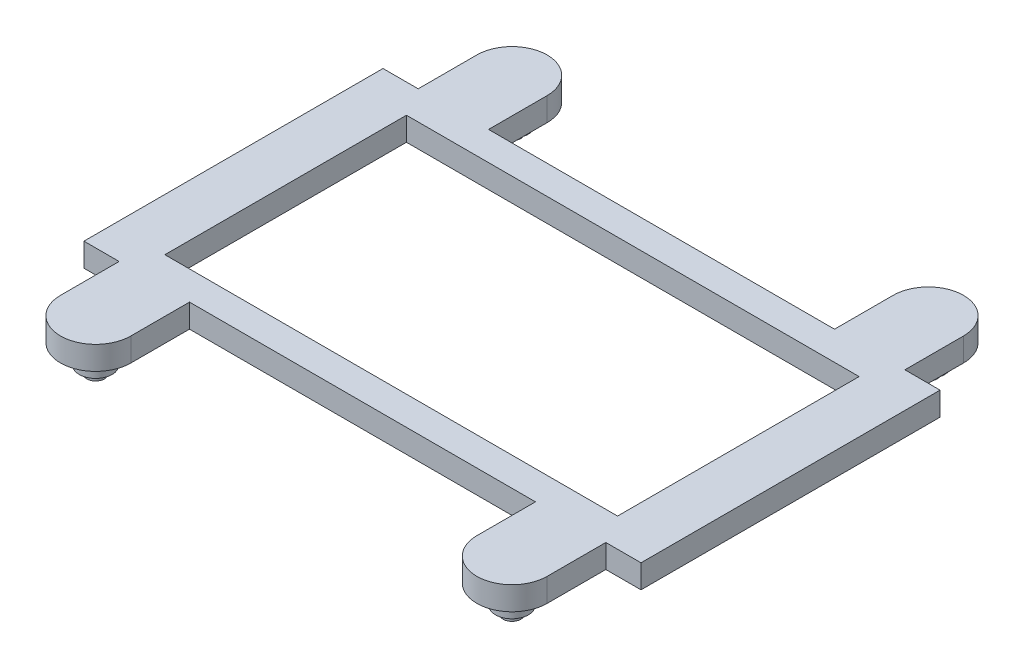
ISO-10303-21;
HEADER;
FILE_DESCRIPTION(('STEP AP214'),'2;1');
FILE_NAME('part.step','',(''),(''),'','','');
FILE_SCHEMA(('AUTOMOTIVE_DESIGN { 1 0 10303 214 1 1 1 1 }'));
ENDSEC;
DATA;
#1=APPLICATION_CONTEXT('core data for automotive mechanical design processes');
#2=APPLICATION_PROTOCOL_DEFINITION('international standard','automotive_design',2000,#1);
#3=PRODUCT_CONTEXT('',#1,'mechanical');
#4=PRODUCT('Part','Part','',(#3));
#5=PRODUCT_RELATED_PRODUCT_CATEGORY('part','',(#4));
#6=PRODUCT_DEFINITION_FORMATION('','',#4);
#7=PRODUCT_DEFINITION_CONTEXT('part definition',#1,'design');
#8=PRODUCT_DEFINITION('design','',#6,#7);
#9=PRODUCT_DEFINITION_SHAPE('','',#8);
#10=(LENGTH_UNIT() NAMED_UNIT(*) SI_UNIT(.MILLI.,.METRE.));
#11=(NAMED_UNIT(*) PLANE_ANGLE_UNIT() SI_UNIT($,.RADIAN.));
#12=(NAMED_UNIT(*) SI_UNIT($,.STERADIAN.) SOLID_ANGLE_UNIT());
#13=UNCERTAINTY_MEASURE_WITH_UNIT(LENGTH_MEASURE(1.E-05),#10,'distance_accuracy_value','');
#14=(GEOMETRIC_REPRESENTATION_CONTEXT(3) GLOBAL_UNCERTAINTY_ASSIGNED_CONTEXT((#13)) GLOBAL_UNIT_ASSIGNED_CONTEXT((#10,
#11,#12)) REPRESENTATION_CONTEXT('',''));
#15=CARTESIAN_POINT('',(0.,0.,0.));
#16=DIRECTION('',(0.,0.,1.));
#17=DIRECTION('',(1.,0.,0.));
#18=AXIS2_PLACEMENT_3D('',#15,#16,#17);
#19=CARTESIAN_POINT('',(-35.5,-8.6,-35.5));
#20=DIRECTION('',(0.,1.,0.));
#21=DIRECTION('',(0.,0.,1.));
#22=AXIS2_PLACEMENT_3D('',#19,#20,#21);
#23=CYLINDRICAL_SURFACE('',#22,1.5);
#24=CARTESIAN_POINT('',(-35.5,-8.6,-35.5));
#25=DIRECTION('',(0.,-1.,0.));
#26=DIRECTION('',(0.,0.,1.));
#27=AXIS2_PLACEMENT_3D('',#24,#25,#26);
#28=CIRCLE('',#27,1.5);
#29=CARTESIAN_POINT('',(-35.5,-8.6,-34.));
#30=VERTEX_POINT('',#29);
#31=EDGE_CURVE('E11',#30,#30,#28,.T.);
#32=ORIENTED_EDGE('',*,*,#31,.F.);
#33=EDGE_LOOP('',(#32));
#34=FACE_BOUND('',#33,.T.);
#35=CARTESIAN_POINT('',(-35.5,-7.3,-35.5));
#36=DIRECTION('',(0.,-1.,0.));
#37=DIRECTION('',(0.,0.,1.));
#38=AXIS2_PLACEMENT_3D('',#35,#36,#37);
#39=CIRCLE('',#38,1.5);
#40=CARTESIAN_POINT('',(-35.5,-7.3,-34.));
#41=VERTEX_POINT('',#40);
#42=EDGE_CURVE('E43',#41,#41,#39,.T.);
#43=ORIENTED_EDGE('',*,*,#42,.T.);
#44=EDGE_LOOP('',(#43));
#45=FACE_BOUND('',#44,.T.);
#46=ADVANCED_FACE('F40',(#34,#45),#23,.T.);
#47=CARTESIAN_POINT('',(-35.5,-8.6,-35.5));
#48=DIRECTION('',(0.,1.,0.));
#49=DIRECTION('',(0.,0.,1.));
#50=AXIS2_PLACEMENT_3D('',#47,#48,#49);
#51=PLANE('',#50);
#52=ORIENTED_EDGE('',*,*,#31,.T.);
#53=EDGE_LOOP('',(#52));
#54=FACE_BOUND('',#53,.T.);
#55=ADVANCED_FACE('F55',(#54),#51,.F.);
#56=CARTESIAN_POINT('',(-35.5,-7.3,-35.5));
#57=DIRECTION('',(0.,1.,0.));
#58=DIRECTION('',(0.,0.,1.));
#59=AXIS2_PLACEMENT_3D('',#56,#57,#58);
#60=PLANE('',#59);
#61=ORIENTED_EDGE('',*,*,#42,.F.);
#62=EDGE_LOOP('',(#61));
#63=FACE_BOUND('',#62,.T.);
#64=ADVANCED_FACE('F53',(#63),#60,.T.);
#65=CLOSED_SHELL('',(#46,#55,#64));
#66=MANIFOLD_SOLID_BREP('B2',#65);
#67=CARTESIAN_POINT('',(35.5,-8.6,-35.5));
#68=DIRECTION('',(0.,1.,0.));
#69=DIRECTION('',(0.,0.,1.));
#70=AXIS2_PLACEMENT_3D('',#67,#68,#69);
#71=CYLINDRICAL_SURFACE('',#70,1.5);
#72=CARTESIAN_POINT('',(35.5,-8.6,-35.5));
#73=DIRECTION('',(0.,-1.,0.));
#74=DIRECTION('',(0.,0.,-1.));
#75=AXIS2_PLACEMENT_3D('',#72,#73,#74);
#76=CIRCLE('',#75,1.5);
#77=CARTESIAN_POINT('',(35.5,-8.6,-37.));
#78=VERTEX_POINT('',#77);
#79=EDGE_CURVE('E39',#78,#78,#76,.T.);
#80=ORIENTED_EDGE('',*,*,#79,.F.);
#81=EDGE_LOOP('',(#80));
#82=FACE_BOUND('',#81,.T.);
#83=CARTESIAN_POINT('',(35.5,-7.3,-35.5));
#84=DIRECTION('',(0.,-1.,0.));
#85=DIRECTION('',(0.,0.,-1.));
#86=AXIS2_PLACEMENT_3D('',#83,#84,#85);
#87=CIRCLE('',#86,1.5);
#88=CARTESIAN_POINT('',(35.5,-7.3,-37.));
#89=VERTEX_POINT('',#88);
#90=EDGE_CURVE('E92',#89,#89,#87,.T.);
#91=ORIENTED_EDGE('',*,*,#90,.T.);
#92=EDGE_LOOP('',(#91));
#93=FACE_BOUND('',#92,.T.);
#94=ADVANCED_FACE('F89',(#82,#93),#71,.T.);
#95=CARTESIAN_POINT('',(35.5,-8.6,-35.5));
#96=DIRECTION('',(0.,-1.,0.));
#97=DIRECTION('',(0.,0.,-1.));
#98=AXIS2_PLACEMENT_3D('',#95,#96,#97);
#99=PLANE('',#98);
#100=ORIENTED_EDGE('',*,*,#79,.T.);
#101=EDGE_LOOP('',(#100));
#102=FACE_BOUND('',#101,.T.);
#103=ADVANCED_FACE('F104',(#102),#99,.T.);
#104=CARTESIAN_POINT('',(35.5,-7.3,-35.5));
#105=DIRECTION('',(0.,-1.,0.));
#106=DIRECTION('',(0.,0.,-1.));
#107=AXIS2_PLACEMENT_3D('',#104,#105,#106);
#108=PLANE('',#107);
#109=ORIENTED_EDGE('',*,*,#90,.F.);
#110=EDGE_LOOP('',(#109));
#111=FACE_BOUND('',#110,.T.);
#112=ADVANCED_FACE('F102',(#111),#108,.F.);
#113=CLOSED_SHELL('',(#94,#103,#112));
#114=MANIFOLD_SOLID_BREP('B6',#113);
#115=CARTESIAN_POINT('',(35.5,-8.6,35.5));
#116=DIRECTION('',(0.,1.,0.));
#117=DIRECTION('',(0.,0.,1.));
#118=AXIS2_PLACEMENT_3D('',#115,#116,#117);
#119=CYLINDRICAL_SURFACE('',#118,1.5);
#120=CARTESIAN_POINT('',(35.5,-8.6,35.5));
#121=DIRECTION('',(0.,-1.,0.));
#122=DIRECTION('',(0.,0.,1.));
#123=AXIS2_PLACEMENT_3D('',#120,#121,#122);
#124=CIRCLE('',#123,1.5);
#125=CARTESIAN_POINT('',(35.5,-8.6,37.));
#126=VERTEX_POINT('',#125);
#127=EDGE_CURVE('E88',#126,#126,#124,.T.);
#128=ORIENTED_EDGE('',*,*,#127,.F.);
#129=EDGE_LOOP('',(#128));
#130=FACE_BOUND('',#129,.T.);
#131=CARTESIAN_POINT('',(35.5,-7.3,35.5));
#132=DIRECTION('',(0.,-1.,0.));
#133=DIRECTION('',(0.,0.,1.));
#134=AXIS2_PLACEMENT_3D('',#131,#132,#133);
#135=CIRCLE('',#134,1.5);
#136=CARTESIAN_POINT('',(35.5,-7.3,37.));
#137=VERTEX_POINT('',#136);
#138=EDGE_CURVE('E141',#137,#137,#135,.T.);
#139=ORIENTED_EDGE('',*,*,#138,.T.);
#140=EDGE_LOOP('',(#139));
#141=FACE_BOUND('',#140,.T.);
#142=ADVANCED_FACE('F138',(#130,#141),#119,.T.);
#143=CARTESIAN_POINT('',(35.5,-8.6,35.5));
#144=DIRECTION('',(0.,1.,0.));
#145=DIRECTION('',(0.,0.,1.));
#146=AXIS2_PLACEMENT_3D('',#143,#144,#145);
#147=PLANE('',#146);
#148=ORIENTED_EDGE('',*,*,#127,.T.);
#149=EDGE_LOOP('',(#148));
#150=FACE_BOUND('',#149,.T.);
#151=ADVANCED_FACE('F153',(#150),#147,.F.);
#152=CARTESIAN_POINT('',(35.5,-7.3,35.5));
#153=DIRECTION('',(0.,1.,0.));
#154=DIRECTION('',(0.,0.,1.));
#155=AXIS2_PLACEMENT_3D('',#152,#153,#154);
#156=PLANE('',#155);
#157=ORIENTED_EDGE('',*,*,#138,.F.);
#158=EDGE_LOOP('',(#157));
#159=FACE_BOUND('',#158,.T.);
#160=ADVANCED_FACE('F151',(#159),#156,.T.);
#161=CLOSED_SHELL('',(#142,#151,#160));
#162=MANIFOLD_SOLID_BREP('B34',#161);
#163=CARTESIAN_POINT('',(-35.5,-8.6,35.5));
#164=DIRECTION('',(0.,1.,0.));
#165=DIRECTION('',(0.,0.,1.));
#166=AXIS2_PLACEMENT_3D('',#163,#164,#165);
#167=CYLINDRICAL_SURFACE('',#166,1.5);
#168=CARTESIAN_POINT('',(-35.5,-8.6,35.5));
#169=DIRECTION('',(0.,-1.,0.));
#170=DIRECTION('',(0.,0.,-1.));
#171=AXIS2_PLACEMENT_3D('',#168,#169,#170);
#172=CIRCLE('',#171,1.5);
#173=CARTESIAN_POINT('',(-35.5,-8.6,34.));
#174=VERTEX_POINT('',#173);
#175=EDGE_CURVE('E137',#174,#174,#172,.T.);
#176=ORIENTED_EDGE('',*,*,#175,.F.);
#177=EDGE_LOOP('',(#176));
#178=FACE_BOUND('',#177,.T.);
#179=CARTESIAN_POINT('',(-35.5,-7.3,35.5));
#180=DIRECTION('',(0.,-1.,0.));
#181=DIRECTION('',(0.,0.,-1.));
#182=AXIS2_PLACEMENT_3D('',#179,#180,#181);
#183=CIRCLE('',#182,1.5);
#184=CARTESIAN_POINT('',(-35.5,-7.3,34.));
#185=VERTEX_POINT('',#184);
#186=EDGE_CURVE('E190',#185,#185,#183,.T.);
#187=ORIENTED_EDGE('',*,*,#186,.T.);
#188=EDGE_LOOP('',(#187));
#189=FACE_BOUND('',#188,.T.);
#190=ADVANCED_FACE('F187',(#178,#189),#167,.T.);
#191=CARTESIAN_POINT('',(-35.5,-8.6,35.5));
#192=DIRECTION('',(0.,-1.,0.));
#193=DIRECTION('',(0.,0.,-1.));
#194=AXIS2_PLACEMENT_3D('',#191,#192,#193);
#195=PLANE('',#194);
#196=ORIENTED_EDGE('',*,*,#175,.T.);
#197=EDGE_LOOP('',(#196));
#198=FACE_BOUND('',#197,.T.);
#199=ADVANCED_FACE('F202',(#198),#195,.T.);
#200=CARTESIAN_POINT('',(-35.5,-7.3,35.5));
#201=DIRECTION('',(0.,-1.,0.));
#202=DIRECTION('',(0.,0.,-1.));
#203=AXIS2_PLACEMENT_3D('',#200,#201,#202);
#204=PLANE('',#203);
#205=ORIENTED_EDGE('',*,*,#186,.F.);
#206=EDGE_LOOP('',(#205));
#207=FACE_BOUND('',#206,.T.);
#208=ADVANCED_FACE('F200',(#207),#204,.F.);
#209=CLOSED_SHELL('',(#190,#199,#208));
#210=MANIFOLD_SOLID_BREP('B83',#209);
#211=CARTESIAN_POINT('',(-35.5,-7.3,-35.5));
#212=DIRECTION('',(0.,1.,0.));
#213=DIRECTION('',(0.,0.,1.));
#214=AXIS2_PLACEMENT_3D('',#211,#212,#213);
#215=CYLINDRICAL_SURFACE('',#214,2.8);
#216=CARTESIAN_POINT('',(-35.5,-7.3,-35.5));
#217=DIRECTION('',(0.,-1.,0.));
#218=DIRECTION('',(0.,0.,1.));
#219=AXIS2_PLACEMENT_3D('',#216,#217,#218);
#220=CIRCLE('',#219,2.8);
#221=CARTESIAN_POINT('',(-35.5,-7.3,-32.7));
#222=VERTEX_POINT('',#221);
#223=EDGE_CURVE('E186',#222,#222,#220,.T.);
#224=ORIENTED_EDGE('',*,*,#223,.F.);
#225=EDGE_LOOP('',(#224));
#226=FACE_BOUND('',#225,.T.);
#227=CARTESIAN_POINT('',(-35.5,-4.,-35.5));
#228=DIRECTION('',(0.,-1.,0.));
#229=DIRECTION('',(0.,0.,1.));
#230=AXIS2_PLACEMENT_3D('',#227,#228,#229);
#231=CIRCLE('',#230,2.8);
#232=CARTESIAN_POINT('',(-35.5,-4.,-32.7));
#233=VERTEX_POINT('',#232);
#234=EDGE_CURVE('E239',#233,#233,#231,.T.);
#235=ORIENTED_EDGE('',*,*,#234,.T.);
#236=EDGE_LOOP('',(#235));
#237=FACE_BOUND('',#236,.T.);
#238=ADVANCED_FACE('F236',(#226,#237),#215,.T.);
#239=CARTESIAN_POINT('',(-35.5,-7.3,-35.5));
#240=DIRECTION('',(0.,1.,0.));
#241=DIRECTION('',(0.,0.,1.));
#242=AXIS2_PLACEMENT_3D('',#239,#240,#241);
#243=PLANE('',#242);
#244=ORIENTED_EDGE('',*,*,#223,.T.);
#245=EDGE_LOOP('',(#244));
#246=FACE_BOUND('',#245,.T.);
#247=ADVANCED_FACE('F251',(#246),#243,.F.);
#248=CARTESIAN_POINT('',(-35.5,-4.,-35.5));
#249=DIRECTION('',(0.,1.,0.));
#250=DIRECTION('',(0.,0.,1.));
#251=AXIS2_PLACEMENT_3D('',#248,#249,#250);
#252=PLANE('',#251);
#253=ORIENTED_EDGE('',*,*,#234,.F.);
#254=EDGE_LOOP('',(#253));
#255=FACE_BOUND('',#254,.T.);
#256=ADVANCED_FACE('F249',(#255),#252,.T.);
#257=CLOSED_SHELL('',(#238,#247,#256));
#258=MANIFOLD_SOLID_BREP('B132',#257);
#259=CARTESIAN_POINT('',(35.5,-7.3,-35.5));
#260=DIRECTION('',(0.,1.,0.));
#261=DIRECTION('',(0.,0.,1.));
#262=AXIS2_PLACEMENT_3D('',#259,#260,#261);
#263=CYLINDRICAL_SURFACE('',#262,2.8);
#264=CARTESIAN_POINT('',(35.5,-7.3,-35.5));
#265=DIRECTION('',(0.,-1.,0.));
#266=DIRECTION('',(0.,0.,-1.));
#267=AXIS2_PLACEMENT_3D('',#264,#265,#266);
#268=CIRCLE('',#267,2.8);
#269=CARTESIAN_POINT('',(35.5,-7.3,-38.3));
#270=VERTEX_POINT('',#269);
#271=EDGE_CURVE('E235',#270,#270,#268,.T.);
#272=ORIENTED_EDGE('',*,*,#271,.F.);
#273=EDGE_LOOP('',(#272));
#274=FACE_BOUND('',#273,.T.);
#275=CARTESIAN_POINT('',(35.5,-4.,-35.5));
#276=DIRECTION('',(0.,-1.,0.));
#277=DIRECTION('',(0.,0.,-1.));
#278=AXIS2_PLACEMENT_3D('',#275,#276,#277);
#279=CIRCLE('',#278,2.8);
#280=CARTESIAN_POINT('',(35.5,-4.,-38.3));
#281=VERTEX_POINT('',#280);
#282=EDGE_CURVE('E288',#281,#281,#279,.T.);
#283=ORIENTED_EDGE('',*,*,#282,.T.);
#284=EDGE_LOOP('',(#283));
#285=FACE_BOUND('',#284,.T.);
#286=ADVANCED_FACE('F285',(#274,#285),#263,.T.);
#287=CARTESIAN_POINT('',(35.5,-7.3,-35.5));
#288=DIRECTION('',(0.,-1.,0.));
#289=DIRECTION('',(0.,0.,-1.));
#290=AXIS2_PLACEMENT_3D('',#287,#288,#289);
#291=PLANE('',#290);
#292=ORIENTED_EDGE('',*,*,#271,.T.);
#293=EDGE_LOOP('',(#292));
#294=FACE_BOUND('',#293,.T.);
#295=ADVANCED_FACE('F300',(#294),#291,.T.);
#296=CARTESIAN_POINT('',(35.5,-4.,-35.5));
#297=DIRECTION('',(0.,-1.,0.));
#298=DIRECTION('',(0.,0.,-1.));
#299=AXIS2_PLACEMENT_3D('',#296,#297,#298);
#300=PLANE('',#299);
#301=ORIENTED_EDGE('',*,*,#282,.F.);
#302=EDGE_LOOP('',(#301));
#303=FACE_BOUND('',#302,.T.);
#304=ADVANCED_FACE('F298',(#303),#300,.F.);
#305=CLOSED_SHELL('',(#286,#295,#304));
#306=MANIFOLD_SOLID_BREP('B181',#305);
#307=CARTESIAN_POINT('',(35.5,-7.3,35.5));
#308=DIRECTION('',(0.,1.,0.));
#309=DIRECTION('',(0.,0.,1.));
#310=AXIS2_PLACEMENT_3D('',#307,#308,#309);
#311=CYLINDRICAL_SURFACE('',#310,2.8);
#312=CARTESIAN_POINT('',(35.5,-7.3,35.5));
#313=DIRECTION('',(0.,-1.,0.));
#314=DIRECTION('',(0.,0.,1.));
#315=AXIS2_PLACEMENT_3D('',#312,#313,#314);
#316=CIRCLE('',#315,2.8);
#317=CARTESIAN_POINT('',(35.5,-7.3,38.3));
#318=VERTEX_POINT('',#317);
#319=EDGE_CURVE('E284',#318,#318,#316,.T.);
#320=ORIENTED_EDGE('',*,*,#319,.F.);
#321=EDGE_LOOP('',(#320));
#322=FACE_BOUND('',#321,.T.);
#323=CARTESIAN_POINT('',(35.5,-4.,35.5));
#324=DIRECTION('',(0.,-1.,0.));
#325=DIRECTION('',(0.,0.,1.));
#326=AXIS2_PLACEMENT_3D('',#323,#324,#325);
#327=CIRCLE('',#326,2.8);
#328=CARTESIAN_POINT('',(35.5,-4.,38.3));
#329=VERTEX_POINT('',#328);
#330=EDGE_CURVE('E337',#329,#329,#327,.T.);
#331=ORIENTED_EDGE('',*,*,#330,.T.);
#332=EDGE_LOOP('',(#331));
#333=FACE_BOUND('',#332,.T.);
#334=ADVANCED_FACE('F334',(#322,#333),#311,.T.);
#335=CARTESIAN_POINT('',(35.5,-7.3,35.5));
#336=DIRECTION('',(0.,1.,0.));
#337=DIRECTION('',(0.,0.,1.));
#338=AXIS2_PLACEMENT_3D('',#335,#336,#337);
#339=PLANE('',#338);
#340=ORIENTED_EDGE('',*,*,#319,.T.);
#341=EDGE_LOOP('',(#340));
#342=FACE_BOUND('',#341,.T.);
#343=ADVANCED_FACE('F349',(#342),#339,.F.);
#344=CARTESIAN_POINT('',(35.5,-4.,35.5));
#345=DIRECTION('',(0.,1.,0.));
#346=DIRECTION('',(0.,0.,1.));
#347=AXIS2_PLACEMENT_3D('',#344,#345,#346);
#348=PLANE('',#347);
#349=ORIENTED_EDGE('',*,*,#330,.F.);
#350=EDGE_LOOP('',(#349));
#351=FACE_BOUND('',#350,.T.);
#352=ADVANCED_FACE('F347',(#351),#348,.T.);
#353=CLOSED_SHELL('',(#334,#343,#352));
#354=MANIFOLD_SOLID_BREP('B230',#353);
#355=CARTESIAN_POINT('',(-35.5,-7.3,35.5));
#356=DIRECTION('',(0.,1.,0.));
#357=DIRECTION('',(0.,0.,1.));
#358=AXIS2_PLACEMENT_3D('',#355,#356,#357);
#359=CYLINDRICAL_SURFACE('',#358,2.8);
#360=CARTESIAN_POINT('',(-35.5,-7.3,35.5));
#361=DIRECTION('',(0.,-1.,0.));
#362=DIRECTION('',(0.,0.,-1.));
#363=AXIS2_PLACEMENT_3D('',#360,#361,#362);
#364=CIRCLE('',#363,2.8);
#365=CARTESIAN_POINT('',(-35.5,-7.3,32.7));
#366=VERTEX_POINT('',#365);
#367=EDGE_CURVE('E333',#366,#366,#364,.T.);
#368=ORIENTED_EDGE('',*,*,#367,.F.);
#369=EDGE_LOOP('',(#368));
#370=FACE_BOUND('',#369,.T.);
#371=CARTESIAN_POINT('',(-35.5,-4.,35.5));
#372=DIRECTION('',(0.,-1.,0.));
#373=DIRECTION('',(0.,0.,-1.));
#374=AXIS2_PLACEMENT_3D('',#371,#372,#373);
#375=CIRCLE('',#374,2.8);
#376=CARTESIAN_POINT('',(-35.5,-4.,32.7));
#377=VERTEX_POINT('',#376);
#378=EDGE_CURVE('E387',#377,#377,#375,.T.);
#379=ORIENTED_EDGE('',*,*,#378,.T.);
#380=EDGE_LOOP('',(#379));
#381=FACE_BOUND('',#380,.T.);
#382=ADVANCED_FACE('F384',(#370,#381),#359,.T.);
#383=CARTESIAN_POINT('',(-35.5,-7.3,35.5));
#384=DIRECTION('',(0.,-1.,0.));
#385=DIRECTION('',(0.,0.,-1.));
#386=AXIS2_PLACEMENT_3D('',#383,#384,#385);
#387=PLANE('',#386);
#388=ORIENTED_EDGE('',*,*,#367,.T.);
#389=EDGE_LOOP('',(#388));
#390=FACE_BOUND('',#389,.T.);
#391=ADVANCED_FACE('F399',(#390),#387,.T.);
#392=CARTESIAN_POINT('',(-35.5,-4.,35.5));
#393=DIRECTION('',(0.,-1.,0.));
#394=DIRECTION('',(0.,0.,-1.));
#395=AXIS2_PLACEMENT_3D('',#392,#393,#394);
#396=PLANE('',#395);
#397=ORIENTED_EDGE('',*,*,#378,.F.);
#398=EDGE_LOOP('',(#397));
#399=FACE_BOUND('',#398,.T.);
#400=ADVANCED_FACE('F397',(#399),#396,.F.);
#401=CLOSED_SHELL('',(#382,#391,#400));
#402=MANIFOLD_SOLID_BREP('B279',#401);
#403=CARTESIAN_POINT('',(41.5,-4.,25.5));
#404=DIRECTION('',(0.,0.,1.));
#405=DIRECTION('',(1.,0.,0.));
#406=AXIS2_PLACEMENT_3D('',#403,#404,#405);
#407=PLANE('',#406);
#408=DIRECTION('',(1.,0.,0.));
#409=VECTOR('',#408,1.);
#410=CARTESIAN_POINT('',(41.5,0.,25.5));
#411=LINE('',#410,#409);
#412=CARTESIAN_POINT('',(41.5,0.,25.5));
#413=VERTEX_POINT('',#412);
#414=CARTESIAN_POINT('',(47.5,0.,25.5));
#415=VERTEX_POINT('',#414);
#416=EDGE_CURVE('E621',#413,#415,#411,.T.);
#417=ORIENTED_EDGE('',*,*,#416,.F.);
#418=DIRECTION('',(0.,1.,0.));
#419=VECTOR('',#418,1.);
#420=CARTESIAN_POINT('',(41.5,-4.,25.5));
#421=LINE('',#420,#419);
#422=CARTESIAN_POINT('',(41.5,-4.,25.5));
#423=VERTEX_POINT('',#422);
#424=EDGE_CURVE('E382',#423,#413,#421,.T.);
#425=ORIENTED_EDGE('',*,*,#424,.F.);
#426=DIRECTION('',(1.,0.,0.));
#427=VECTOR('',#426,1.);
#428=CARTESIAN_POINT('',(41.5,-4.,25.5));
#429=LINE('',#428,#427);
#430=CARTESIAN_POINT('',(47.5,-4.,25.5));
#431=VERTEX_POINT('',#430);
#432=EDGE_CURVE('E622',#423,#431,#429,.T.);
#433=ORIENTED_EDGE('',*,*,#432,.T.);
#434=DIRECTION('',(0.,1.,0.));
#435=VECTOR('',#434,1.);
#436=CARTESIAN_POINT('',(47.5,-4.,25.5));
#437=LINE('',#436,#435);
#438=EDGE_CURVE('E428',#431,#415,#437,.T.);
#439=ORIENTED_EDGE('',*,*,#438,.T.);
#440=EDGE_LOOP('',(#417,#425,#433,#439));
#441=FACE_BOUND('',#440,.T.);
#442=ADVANCED_FACE('F425',(#441),#407,.T.);
#443=CARTESIAN_POINT('',(41.5,-4.,25.5));
#444=DIRECTION('',(1.,0.,0.));
#445=DIRECTION('',(0.,0.,-1.));
#446=AXIS2_PLACEMENT_3D('',#443,#444,#445);
#447=PLANE('',#446);
#448=DIRECTION('',(0.,0.,-1.));
#449=VECTOR('',#448,1.);
#450=CARTESIAN_POINT('',(41.5,0.,25.5));
#451=LINE('',#450,#449);
#452=CARTESIAN_POINT('',(41.5,0.,35.5));
#453=VERTEX_POINT('',#452);
#454=EDGE_CURVE('E626',#453,#413,#451,.T.);
#455=ORIENTED_EDGE('',*,*,#454,.F.);
#456=DIRECTION('',(0.,1.,0.));
#457=VECTOR('',#456,1.);
#458=CARTESIAN_POINT('',(41.5,-4.,35.5));
#459=LINE('',#458,#457);
#460=CARTESIAN_POINT('',(41.5,-4.,35.5));
#461=VERTEX_POINT('',#460);
#462=EDGE_CURVE('E433',#461,#453,#459,.T.);
#463=ORIENTED_EDGE('',*,*,#462,.F.);
#464=DIRECTION('',(0.,0.,-1.));
#465=VECTOR('',#464,1.);
#466=CARTESIAN_POINT('',(41.5,-4.,25.5));
#467=LINE('',#466,#465);
#468=EDGE_CURVE('E678',#461,#423,#467,.T.);
#469=ORIENTED_EDGE('',*,*,#468,.T.);
#470=ORIENTED_EDGE('',*,*,#424,.T.);
#471=EDGE_LOOP('',(#455,#463,#469,#470));
#472=FACE_BOUND('',#471,.T.);
#473=ADVANCED_FACE('F785',(#472),#447,.T.);
#474=CARTESIAN_POINT('',(35.5,-4.,35.5));
#475=DIRECTION('',(0.,1.,0.));
#476=DIRECTION('',(0.,0.,1.));
#477=AXIS2_PLACEMENT_3D('',#474,#475,#476);
#478=CYLINDRICAL_SURFACE('',#477,6.);
#479=CARTESIAN_POINT('',(35.5,0.,35.5));
#480=DIRECTION('',(0.,1.,0.));
#481=DIRECTION('',(0.,0.,1.));
#482=AXIS2_PLACEMENT_3D('',#479,#480,#481);
#483=CIRCLE('',#482,6.);
#484=CARTESIAN_POINT('',(29.5,0.,35.5));
#485=VERTEX_POINT('',#484);
#486=EDGE_CURVE('E734',#485,#453,#483,.T.);
#487=ORIENTED_EDGE('',*,*,#486,.F.);
#488=DIRECTION('',(0.,1.,0.));
#489=VECTOR('',#488,1.);
#490=CARTESIAN_POINT('',(29.5,-4.,35.5));
#491=LINE('',#490,#489);
#492=CARTESIAN_POINT('',(29.5,-4.,35.5));
#493=VERTEX_POINT('',#492);
#494=EDGE_CURVE('E740',#493,#485,#491,.T.);
#495=ORIENTED_EDGE('',*,*,#494,.F.);
#496=CARTESIAN_POINT('',(35.5,-4.,35.5));
#497=DIRECTION('',(0.,1.,0.));
#498=DIRECTION('',(0.,0.,1.));
#499=AXIS2_PLACEMENT_3D('',#496,#497,#498);
#500=CIRCLE('',#499,6.);
#501=EDGE_CURVE('E675',#493,#461,#500,.T.);
#502=ORIENTED_EDGE('',*,*,#501,.T.);
#503=ORIENTED_EDGE('',*,*,#462,.T.);
#504=EDGE_LOOP('',(#487,#495,#502,#503));
#505=FACE_BOUND('',#504,.T.);
#506=ADVANCED_FACE('F854',(#505),#478,.T.);
#507=CARTESIAN_POINT('',(29.5,-4.,25.5));
#508=DIRECTION('',(-1.,0.,0.));
#509=DIRECTION('',(0.,0.,1.));
#510=AXIS2_PLACEMENT_3D('',#507,#508,#509);
#511=PLANE('',#510);
#512=DIRECTION('',(0.,0.,1.));
#513=VECTOR('',#512,1.);
#514=CARTESIAN_POINT('',(29.5,0.,25.5));
#515=LINE('',#514,#513);
#516=CARTESIAN_POINT('',(29.5,0.,25.5));
#517=VERTEX_POINT('',#516);
#518=EDGE_CURVE('E731',#517,#485,#515,.T.);
#519=ORIENTED_EDGE('',*,*,#518,.F.);
#520=DIRECTION('',(0.,1.,0.));
#521=VECTOR('',#520,1.);
#522=CARTESIAN_POINT('',(29.5,-4.,25.5));
#523=LINE('',#522,#521);
#524=CARTESIAN_POINT('',(29.5,-4.,25.5));
#525=VERTEX_POINT('',#524);
#526=EDGE_CURVE('E742',#525,#517,#523,.T.);
#527=ORIENTED_EDGE('',*,*,#526,.F.);
#528=DIRECTION('',(0.,0.,1.));
#529=VECTOR('',#528,1.);
#530=CARTESIAN_POINT('',(29.5,-4.,25.5));
#531=LINE('',#530,#529);
#532=EDGE_CURVE('E672',#525,#493,#531,.T.);
#533=ORIENTED_EDGE('',*,*,#532,.T.);
#534=ORIENTED_EDGE('',*,*,#494,.T.);
#535=EDGE_LOOP('',(#519,#527,#533,#534));
#536=FACE_BOUND('',#535,.T.);
#537=ADVANCED_FACE('F852',(#536),#511,.T.);
#538=CARTESIAN_POINT('',(3.00000000000001,-4.,25.5));
#539=DIRECTION('',(0.,0.,1.));
#540=DIRECTION('',(1.,0.,0.));
#541=AXIS2_PLACEMENT_3D('',#538,#539,#540);
#542=PLANE('',#541);
#543=DIRECTION('',(1.,0.,0.));
#544=VECTOR('',#543,1.);
#545=CARTESIAN_POINT('',(3.00000000000001,0.,25.5));
#546=LINE('',#545,#544);
#547=CARTESIAN_POINT('',(-29.5,0.,25.5));
#548=VERTEX_POINT('',#547);
#549=EDGE_CURVE('E728',#548,#517,#546,.T.);
#550=ORIENTED_EDGE('',*,*,#549,.F.);
#551=DIRECTION('',(0.,1.,0.));
#552=VECTOR('',#551,1.);
#553=CARTESIAN_POINT('',(-29.5,-4.,25.5));
#554=LINE('',#553,#552);
#555=CARTESIAN_POINT('',(-29.5,-4.,25.5));
#556=VERTEX_POINT('',#555);
#557=EDGE_CURVE('E744',#556,#548,#554,.T.);
#558=ORIENTED_EDGE('',*,*,#557,.F.);
#559=DIRECTION('',(1.,0.,0.));
#560=VECTOR('',#559,1.);
#561=CARTESIAN_POINT('',(-29.5,-4.,25.5));
#562=LINE('',#561,#560);
#563=EDGE_CURVE('E670',#556,#525,#562,.T.);
#564=ORIENTED_EDGE('',*,*,#563,.T.);
#565=ORIENTED_EDGE('',*,*,#526,.T.);
#566=EDGE_LOOP('',(#550,#558,#564,#565));
#567=FACE_BOUND('',#566,.T.);
#568=ADVANCED_FACE('F847',(#567),#542,.T.);
#569=CARTESIAN_POINT('',(-29.5,-4.,25.5));
#570=DIRECTION('',(1.,0.,0.));
#571=DIRECTION('',(0.,0.,-1.));
#572=AXIS2_PLACEMENT_3D('',#569,#570,#571);
#573=PLANE('',#572);
#574=DIRECTION('',(0.,0.,-1.));
#575=VECTOR('',#574,1.);
#576=CARTESIAN_POINT('',(-29.5,0.,25.5));
#577=LINE('',#576,#575);
#578=CARTESIAN_POINT('',(-29.5,0.,35.5));
#579=VERTEX_POINT('',#578);
#580=EDGE_CURVE('E725',#579,#548,#577,.T.);
#581=ORIENTED_EDGE('',*,*,#580,.F.);
#582=DIRECTION('',(0.,1.,0.));
#583=VECTOR('',#582,1.);
#584=CARTESIAN_POINT('',(-29.5,-4.,35.5));
#585=LINE('',#584,#583);
#586=CARTESIAN_POINT('',(-29.5,-4.,35.5));
#587=VERTEX_POINT('',#586);
#588=EDGE_CURVE('E747',#587,#579,#585,.T.);
#589=ORIENTED_EDGE('',*,*,#588,.F.);
#590=DIRECTION('',(0.,0.,-1.));
#591=VECTOR('',#590,1.);
#592=CARTESIAN_POINT('',(-29.5,-4.,25.5));
#593=LINE('',#592,#591);
#594=EDGE_CURVE('E667',#587,#556,#593,.T.);
#595=ORIENTED_EDGE('',*,*,#594,.T.);
#596=ORIENTED_EDGE('',*,*,#557,.T.);
#597=EDGE_LOOP('',(#581,#589,#595,#596));
#598=FACE_BOUND('',#597,.T.);
#599=ADVANCED_FACE('F843',(#598),#573,.T.);
#600=CARTESIAN_POINT('',(-35.5,-4.,35.5));
#601=DIRECTION('',(0.,1.,0.));
#602=DIRECTION('',(0.,0.,1.));
#603=AXIS2_PLACEMENT_3D('',#600,#601,#602);
#604=CYLINDRICAL_SURFACE('',#603,6.00000000000001);
#605=CARTESIAN_POINT('',(-35.5,0.,35.5));
#606=DIRECTION('',(0.,1.,0.));
#607=DIRECTION('',(0.,0.,-1.));
#608=AXIS2_PLACEMENT_3D('',#605,#606,#607);
#609=CIRCLE('',#608,6.00000000000001);
#610=CARTESIAN_POINT('',(-41.5,0.,35.5));
#611=VERTEX_POINT('',#610);
#612=EDGE_CURVE('E722',#611,#579,#609,.T.);
#613=ORIENTED_EDGE('',*,*,#612,.F.);
#614=DIRECTION('',(0.,1.,0.));
#615=VECTOR('',#614,1.);
#616=CARTESIAN_POINT('',(-41.5,-4.,35.5));
#617=LINE('',#616,#615);
#618=CARTESIAN_POINT('',(-41.5,-4.,35.5));
#619=VERTEX_POINT('',#618);
#620=EDGE_CURVE('E749',#619,#611,#617,.T.);
#621=ORIENTED_EDGE('',*,*,#620,.F.);
#622=CARTESIAN_POINT('',(-35.5,-4.,35.5));
#623=DIRECTION('',(0.,1.,0.));
#624=DIRECTION('',(0.,0.,-1.));
#625=AXIS2_PLACEMENT_3D('',#622,#623,#624);
#626=CIRCLE('',#625,6.00000000000001);
#627=EDGE_CURVE('E664',#619,#587,#626,.T.);
#628=ORIENTED_EDGE('',*,*,#627,.T.);
#629=ORIENTED_EDGE('',*,*,#588,.T.);
#630=EDGE_LOOP('',(#613,#621,#628,#629));
#631=FACE_BOUND('',#630,.T.);
#632=ADVANCED_FACE('F840',(#631),#604,.T.);
#633=CARTESIAN_POINT('',(-41.5,-4.,25.5));
#634=DIRECTION('',(-1.,0.,0.));
#635=DIRECTION('',(0.,0.,1.));
#636=AXIS2_PLACEMENT_3D('',#633,#634,#635);
#637=PLANE('',#636);
#638=DIRECTION('',(0.,0.,1.));
#639=VECTOR('',#638,1.);
#640=CARTESIAN_POINT('',(-41.5,0.,25.5));
#641=LINE('',#640,#639);
#642=CARTESIAN_POINT('',(-41.5,0.,25.5));
#643=VERTEX_POINT('',#642);
#644=EDGE_CURVE('E719',#643,#611,#641,.T.);
#645=ORIENTED_EDGE('',*,*,#644,.F.);
#646=DIRECTION('',(0.,1.,0.));
#647=VECTOR('',#646,1.);
#648=CARTESIAN_POINT('',(-41.5,-4.,25.5));
#649=LINE('',#648,#647);
#650=CARTESIAN_POINT('',(-41.5,-4.,25.5));
#651=VERTEX_POINT('',#650);
#652=EDGE_CURVE('E751',#651,#643,#649,.T.);
#653=ORIENTED_EDGE('',*,*,#652,.F.);
#654=DIRECTION('',(0.,0.,1.));
#655=VECTOR('',#654,1.);
#656=CARTESIAN_POINT('',(-41.5,-4.,25.5));
#657=LINE('',#656,#655);
#658=EDGE_CURVE('E661',#651,#619,#657,.T.);
#659=ORIENTED_EDGE('',*,*,#658,.T.);
#660=ORIENTED_EDGE('',*,*,#620,.T.);
#661=EDGE_LOOP('',(#645,#653,#659,#660));
#662=FACE_BOUND('',#661,.T.);
#663=ADVANCED_FACE('F836',(#662),#637,.T.);
#664=CARTESIAN_POINT('',(-47.5,-4.,25.5));
#665=DIRECTION('',(0.,0.,1.));
#666=DIRECTION('',(1.,0.,0.));
#667=AXIS2_PLACEMENT_3D('',#664,#665,#666);
#668=PLANE('',#667);
#669=DIRECTION('',(1.,0.,0.));
#670=VECTOR('',#669,1.);
#671=CARTESIAN_POINT('',(-47.5,0.,25.5));
#672=LINE('',#671,#670);
#673=CARTESIAN_POINT('',(-47.5,0.,25.5));
#674=VERTEX_POINT('',#673);
#675=EDGE_CURVE('E716',#674,#643,#672,.T.);
#676=ORIENTED_EDGE('',*,*,#675,.F.);
#677=DIRECTION('',(0.,1.,0.));
#678=VECTOR('',#677,1.);
#679=CARTESIAN_POINT('',(-47.5,-4.,25.5));
#680=LINE('',#679,#678);
#681=CARTESIAN_POINT('',(-47.5,-4.,25.5));
#682=VERTEX_POINT('',#681);
#683=EDGE_CURVE('E753',#682,#674,#680,.T.);
#684=ORIENTED_EDGE('',*,*,#683,.F.);
#685=DIRECTION('',(1.,0.,0.));
#686=VECTOR('',#685,1.);
#687=CARTESIAN_POINT('',(-47.5,-4.,25.5));
#688=LINE('',#687,#686);
#689=EDGE_CURVE('E658',#682,#651,#688,.T.);
#690=ORIENTED_EDGE('',*,*,#689,.T.);
#691=ORIENTED_EDGE('',*,*,#652,.T.);
#692=EDGE_LOOP('',(#676,#684,#690,#691));
#693=FACE_BOUND('',#692,.T.);
#694=ADVANCED_FACE('F832',(#693),#668,.T.);
#695=CARTESIAN_POINT('',(-47.5,-4.,-25.5));
#696=DIRECTION('',(-1.,0.,0.));
#697=DIRECTION('',(0.,0.,1.));
#698=AXIS2_PLACEMENT_3D('',#695,#696,#697);
#699=PLANE('',#698);
#700=DIRECTION('',(0.,0.,1.));
#701=VECTOR('',#700,1.);
#702=CARTESIAN_POINT('',(-47.5,0.,-25.5));
#703=LINE('',#702,#701);
#704=CARTESIAN_POINT('',(-47.5,0.,-25.5));
#705=VERTEX_POINT('',#704);
#706=EDGE_CURVE('E713',#705,#674,#703,.T.);
#707=ORIENTED_EDGE('',*,*,#706,.F.);
#708=DIRECTION('',(0.,1.,0.));
#709=VECTOR('',#708,1.);
#710=CARTESIAN_POINT('',(-47.5,-4.,-25.5));
#711=LINE('',#710,#709);
#712=CARTESIAN_POINT('',(-47.5,-4.,-25.5));
#713=VERTEX_POINT('',#712);
#714=EDGE_CURVE('E755',#713,#705,#711,.T.);
#715=ORIENTED_EDGE('',*,*,#714,.F.);
#716=DIRECTION('',(0.,0.,1.));
#717=VECTOR('',#716,1.);
#718=CARTESIAN_POINT('',(-47.5,-4.,-25.5));
#719=LINE('',#718,#717);
#720=EDGE_CURVE('E655',#713,#682,#719,.T.);
#721=ORIENTED_EDGE('',*,*,#720,.T.);
#722=ORIENTED_EDGE('',*,*,#683,.T.);
#723=EDGE_LOOP('',(#707,#715,#721,#722));
#724=FACE_BOUND('',#723,.T.);
#725=ADVANCED_FACE('F828',(#724),#699,.T.);
#726=CARTESIAN_POINT('',(-47.5,-4.,-25.5));
#727=DIRECTION('',(0.,0.,-1.));
#728=DIRECTION('',(-1.,0.,0.));
#729=AXIS2_PLACEMENT_3D('',#726,#727,#728);
#730=PLANE('',#729);
#731=DIRECTION('',(-1.,0.,0.));
#732=VECTOR('',#731,1.);
#733=CARTESIAN_POINT('',(-47.5,0.,-25.5));
#734=LINE('',#733,#732);
#735=CARTESIAN_POINT('',(-41.5,0.,-25.5));
#736=VERTEX_POINT('',#735);
#737=EDGE_CURVE('E710',#736,#705,#734,.T.);
#738=ORIENTED_EDGE('',*,*,#737,.F.);
#739=DIRECTION('',(0.,1.,0.));
#740=VECTOR('',#739,1.);
#741=CARTESIAN_POINT('',(-41.5,-4.,-25.5));
#742=LINE('',#741,#740);
#743=CARTESIAN_POINT('',(-41.5,-4.,-25.5));
#744=VERTEX_POINT('',#743);
#745=EDGE_CURVE('E757',#744,#736,#742,.T.);
#746=ORIENTED_EDGE('',*,*,#745,.F.);
#747=DIRECTION('',(-1.,0.,0.));
#748=VECTOR('',#747,1.);
#749=CARTESIAN_POINT('',(-47.5,-4.,-25.5));
#750=LINE('',#749,#748);
#751=EDGE_CURVE('E652',#744,#713,#750,.T.);
#752=ORIENTED_EDGE('',*,*,#751,.T.);
#753=ORIENTED_EDGE('',*,*,#714,.T.);
#754=EDGE_LOOP('',(#738,#746,#752,#753));
#755=FACE_BOUND('',#754,.T.);
#756=ADVANCED_FACE('F824',(#755),#730,.T.);
#757=CARTESIAN_POINT('',(-41.5,-4.,-25.5));
#758=DIRECTION('',(-1.,0.,0.));
#759=DIRECTION('',(0.,0.,1.));
#760=AXIS2_PLACEMENT_3D('',#757,#758,#759);
#761=PLANE('',#760);
#762=DIRECTION('',(0.,0.,1.));
#763=VECTOR('',#762,1.);
#764=CARTESIAN_POINT('',(-41.5,0.,-25.5));
#765=LINE('',#764,#763);
#766=CARTESIAN_POINT('',(-41.5,0.,-35.5));
#767=VERTEX_POINT('',#766);
#768=EDGE_CURVE('E707',#767,#736,#765,.T.);
#769=ORIENTED_EDGE('',*,*,#768,.F.);
#770=DIRECTION('',(0.,1.,0.));
#771=VECTOR('',#770,1.);
#772=CARTESIAN_POINT('',(-41.5,-4.,-35.5));
#773=LINE('',#772,#771);
#774=CARTESIAN_POINT('',(-41.5,-4.,-35.5));
#775=VERTEX_POINT('',#774);
#776=EDGE_CURVE('E759',#775,#767,#773,.T.);
#777=ORIENTED_EDGE('',*,*,#776,.F.);
#778=DIRECTION('',(0.,0.,1.));
#779=VECTOR('',#778,1.);
#780=CARTESIAN_POINT('',(-41.5,-4.,-25.5));
#781=LINE('',#780,#779);
#782=EDGE_CURVE('E649',#775,#744,#781,.T.);
#783=ORIENTED_EDGE('',*,*,#782,.T.);
#784=ORIENTED_EDGE('',*,*,#745,.T.);
#785=EDGE_LOOP('',(#769,#777,#783,#784));
#786=FACE_BOUND('',#785,.T.);
#787=ADVANCED_FACE('F820',(#786),#761,.T.);
#788=CARTESIAN_POINT('',(-35.5,-4.,-35.5));
#789=DIRECTION('',(0.,1.,0.));
#790=DIRECTION('',(0.,0.,1.));
#791=AXIS2_PLACEMENT_3D('',#788,#789,#790);
#792=CYLINDRICAL_SURFACE('',#791,6.);
#793=CARTESIAN_POINT('',(-35.5,0.,-35.5));
#794=DIRECTION('',(0.,1.,0.));
#795=DIRECTION('',(0.,0.,1.));
#796=AXIS2_PLACEMENT_3D('',#793,#794,#795);
#797=CIRCLE('',#796,6.);
#798=CARTESIAN_POINT('',(-29.5,0.,-35.5));
#799=VERTEX_POINT('',#798);
#800=EDGE_CURVE('E704',#799,#767,#797,.T.);
#801=ORIENTED_EDGE('',*,*,#800,.F.);
#802=DIRECTION('',(0.,1.,0.));
#803=VECTOR('',#802,1.);
#804=CARTESIAN_POINT('',(-29.5,-4.,-35.5));
#805=LINE('',#804,#803);
#806=CARTESIAN_POINT('',(-29.5,-4.,-35.5));
#807=VERTEX_POINT('',#806);
#808=EDGE_CURVE('E761',#807,#799,#805,.T.);
#809=ORIENTED_EDGE('',*,*,#808,.F.);
#810=CARTESIAN_POINT('',(-35.5,-4.,-35.5));
#811=DIRECTION('',(0.,1.,0.));
#812=DIRECTION('',(0.,0.,1.));
#813=AXIS2_PLACEMENT_3D('',#810,#811,#812);
#814=CIRCLE('',#813,6.);
#815=EDGE_CURVE('E646',#807,#775,#814,.T.);
#816=ORIENTED_EDGE('',*,*,#815,.T.);
#817=ORIENTED_EDGE('',*,*,#776,.T.);
#818=EDGE_LOOP('',(#801,#809,#816,#817));
#819=FACE_BOUND('',#818,.T.);
#820=ADVANCED_FACE('F816',(#819),#792,.T.);
#821=CARTESIAN_POINT('',(-29.5,-4.,-25.5));
#822=DIRECTION('',(1.,0.,0.));
#823=DIRECTION('',(0.,0.,-1.));
#824=AXIS2_PLACEMENT_3D('',#821,#822,#823);
#825=PLANE('',#824);
#826=DIRECTION('',(0.,0.,-1.));
#827=VECTOR('',#826,1.);
#828=CARTESIAN_POINT('',(-29.5,0.,-25.5));
#829=LINE('',#828,#827);
#830=CARTESIAN_POINT('',(-29.5,0.,-25.5));
#831=VERTEX_POINT('',#830);
#832=EDGE_CURVE('E701',#831,#799,#829,.T.);
#833=ORIENTED_EDGE('',*,*,#832,.F.);
#834=DIRECTION('',(0.,1.,0.));
#835=VECTOR('',#834,1.);
#836=CARTESIAN_POINT('',(-29.5,-4.,-25.5));
#837=LINE('',#836,#835);
#838=CARTESIAN_POINT('',(-29.5,-4.,-25.5));
#839=VERTEX_POINT('',#838);
#840=EDGE_CURVE('E763',#839,#831,#837,.T.);
#841=ORIENTED_EDGE('',*,*,#840,.F.);
#842=DIRECTION('',(0.,0.,-1.));
#843=VECTOR('',#842,1.);
#844=CARTESIAN_POINT('',(-29.5,-4.,-25.5));
#845=LINE('',#844,#843);
#846=EDGE_CURVE('E643',#839,#807,#845,.T.);
#847=ORIENTED_EDGE('',*,*,#846,.T.);
#848=ORIENTED_EDGE('',*,*,#808,.T.);
#849=EDGE_LOOP('',(#833,#841,#847,#848));
#850=FACE_BOUND('',#849,.T.);
#851=ADVANCED_FACE('F812',(#850),#825,.T.);
#852=CARTESIAN_POINT('',(-29.5,-4.,-25.5));
#853=DIRECTION('',(0.,0.,-1.));
#854=DIRECTION('',(-1.,0.,0.));
#855=AXIS2_PLACEMENT_3D('',#852,#853,#854);
#856=PLANE('',#855);
#857=DIRECTION('',(-1.,0.,0.));
#858=VECTOR('',#857,1.);
#859=CARTESIAN_POINT('',(-29.5,0.,-25.5));
#860=LINE('',#859,#858);
#861=CARTESIAN_POINT('',(29.5,0.,-25.5));
#862=VERTEX_POINT('',#861);
#863=EDGE_CURVE('E698',#862,#831,#860,.T.);
#864=ORIENTED_EDGE('',*,*,#863,.F.);
#865=DIRECTION('',(0.,1.,0.));
#866=VECTOR('',#865,1.);
#867=CARTESIAN_POINT('',(29.5,-4.,-25.5));
#868=LINE('',#867,#866);
#869=CARTESIAN_POINT('',(29.5,-4.,-25.5));
#870=VERTEX_POINT('',#869);
#871=EDGE_CURVE('E765',#870,#862,#868,.T.);
#872=ORIENTED_EDGE('',*,*,#871,.F.);
#873=DIRECTION('',(-1.,0.,0.));
#874=VECTOR('',#873,1.);
#875=CARTESIAN_POINT('',(3.00000000000001,-4.,-25.5));
#876=LINE('',#875,#874);
#877=EDGE_CURVE('E641',#870,#839,#876,.T.);
#878=ORIENTED_EDGE('',*,*,#877,.T.);
#879=ORIENTED_EDGE('',*,*,#840,.T.);
#880=EDGE_LOOP('',(#864,#872,#878,#879));
#881=FACE_BOUND('',#880,.T.);
#882=ADVANCED_FACE('F807',(#881),#856,.T.);
#883=CARTESIAN_POINT('',(29.5,-4.,-25.5));
#884=DIRECTION('',(-1.,0.,0.));
#885=DIRECTION('',(0.,0.,1.));
#886=AXIS2_PLACEMENT_3D('',#883,#884,#885);
#887=PLANE('',#886);
#888=DIRECTION('',(0.,0.,1.));
#889=VECTOR('',#888,1.);
#890=CARTESIAN_POINT('',(29.5,0.,-25.5));
#891=LINE('',#890,#889);
#892=CARTESIAN_POINT('',(29.5,0.,-35.5));
#893=VERTEX_POINT('',#892);
#894=EDGE_CURVE('E695',#893,#862,#891,.T.);
#895=ORIENTED_EDGE('',*,*,#894,.F.);
#896=DIRECTION('',(0.,1.,0.));
#897=VECTOR('',#896,1.);
#898=CARTESIAN_POINT('',(29.5,-4.,-35.5));
#899=LINE('',#898,#897);
#900=CARTESIAN_POINT('',(29.5,-4.,-35.5));
#901=VERTEX_POINT('',#900);
#902=EDGE_CURVE('E768',#901,#893,#899,.T.);
#903=ORIENTED_EDGE('',*,*,#902,.F.);
#904=DIRECTION('',(0.,0.,1.));
#905=VECTOR('',#904,1.);
#906=CARTESIAN_POINT('',(29.5,-4.,-25.5));
#907=LINE('',#906,#905);
#908=EDGE_CURVE('E638',#901,#870,#907,.T.);
#909=ORIENTED_EDGE('',*,*,#908,.T.);
#910=ORIENTED_EDGE('',*,*,#871,.T.);
#911=EDGE_LOOP('',(#895,#903,#909,#910));
#912=FACE_BOUND('',#911,.T.);
#913=ADVANCED_FACE('F804',(#912),#887,.T.);
#914=CARTESIAN_POINT('',(35.5,-4.,-35.5));
#915=DIRECTION('',(0.,1.,0.));
#916=DIRECTION('',(0.,0.,1.));
#917=AXIS2_PLACEMENT_3D('',#914,#915,#916);
#918=CYLINDRICAL_SURFACE('',#917,6.);
#919=CARTESIAN_POINT('',(35.5,0.,-35.5));
#920=DIRECTION('',(0.,1.,0.));
#921=DIRECTION('',(0.,0.,-1.));
#922=AXIS2_PLACEMENT_3D('',#919,#920,#921);
#923=CIRCLE('',#922,6.);
#924=CARTESIAN_POINT('',(41.5,0.,-35.5));
#925=VERTEX_POINT('',#924);
#926=EDGE_CURVE('E692',#925,#893,#923,.T.);
#927=ORIENTED_EDGE('',*,*,#926,.F.);
#928=DIRECTION('',(0.,1.,0.));
#929=VECTOR('',#928,1.);
#930=CARTESIAN_POINT('',(41.5,-4.,-35.5));
#931=LINE('',#930,#929);
#932=CARTESIAN_POINT('',(41.5,-4.,-35.5));
#933=VERTEX_POINT('',#932);
#934=EDGE_CURVE('E770',#933,#925,#931,.T.);
#935=ORIENTED_EDGE('',*,*,#934,.F.);
#936=CARTESIAN_POINT('',(35.5,-4.,-35.5));
#937=DIRECTION('',(0.,1.,0.));
#938=DIRECTION('',(0.,0.,-1.));
#939=AXIS2_PLACEMENT_3D('',#936,#937,#938);
#940=CIRCLE('',#939,6.);
#941=EDGE_CURVE('E635',#933,#901,#940,.T.);
#942=ORIENTED_EDGE('',*,*,#941,.T.);
#943=ORIENTED_EDGE('',*,*,#902,.T.);
#944=EDGE_LOOP('',(#927,#935,#942,#943));
#945=FACE_BOUND('',#944,.T.);
#946=ADVANCED_FACE('F800',(#945),#918,.T.);
#947=CARTESIAN_POINT('',(41.5,-4.,-25.5));
#948=DIRECTION('',(1.,0.,0.));
#949=DIRECTION('',(0.,0.,-1.));
#950=AXIS2_PLACEMENT_3D('',#947,#948,#949);
#951=PLANE('',#950);
#952=DIRECTION('',(0.,0.,-1.));
#953=VECTOR('',#952,1.);
#954=CARTESIAN_POINT('',(41.5,0.,-25.5));
#955=LINE('',#954,#953);
#956=CARTESIAN_POINT('',(41.5,0.,-25.5));
#957=VERTEX_POINT('',#956);
#958=EDGE_CURVE('E689',#957,#925,#955,.T.);
#959=ORIENTED_EDGE('',*,*,#958,.F.);
#960=DIRECTION('',(0.,1.,0.));
#961=VECTOR('',#960,1.);
#962=CARTESIAN_POINT('',(41.5,-4.,-25.5));
#963=LINE('',#962,#961);
#964=CARTESIAN_POINT('',(41.5,-4.,-25.5));
#965=VERTEX_POINT('',#964);
#966=EDGE_CURVE('E772',#965,#957,#963,.T.);
#967=ORIENTED_EDGE('',*,*,#966,.F.);
#968=DIRECTION('',(0.,0.,-1.));
#969=VECTOR('',#968,1.);
#970=CARTESIAN_POINT('',(41.5,-4.,-25.5));
#971=LINE('',#970,#969);
#972=EDGE_CURVE('E632',#965,#933,#971,.T.);
#973=ORIENTED_EDGE('',*,*,#972,.T.);
#974=ORIENTED_EDGE('',*,*,#934,.T.);
#975=EDGE_LOOP('',(#959,#967,#973,#974));
#976=FACE_BOUND('',#975,.T.);
#977=ADVANCED_FACE('F798',(#976),#951,.T.);
#978=CARTESIAN_POINT('',(41.5,-4.,-25.5));
#979=DIRECTION('',(0.,0.,-1.));
#980=DIRECTION('',(-1.,0.,0.));
#981=AXIS2_PLACEMENT_3D('',#978,#979,#980);
#982=PLANE('',#981);
#983=DIRECTION('',(-1.,0.,0.));
#984=VECTOR('',#983,1.);
#985=CARTESIAN_POINT('',(41.5,0.,-25.5));
#986=LINE('',#985,#984);
#987=CARTESIAN_POINT('',(47.5,0.,-25.5));
#988=VERTEX_POINT('',#987);
#989=EDGE_CURVE('E686',#988,#957,#986,.T.);
#990=ORIENTED_EDGE('',*,*,#989,.F.);
#991=DIRECTION('',(0.,1.,0.));
#992=VECTOR('',#991,1.);
#993=CARTESIAN_POINT('',(47.5,-4.,-25.5));
#994=LINE('',#993,#992);
#995=CARTESIAN_POINT('',(47.5,-4.,-25.5));
#996=VERTEX_POINT('',#995);
#997=EDGE_CURVE('E773',#996,#988,#994,.T.);
#998=ORIENTED_EDGE('',*,*,#997,.F.);
#999=DIRECTION('',(-1.,0.,0.));
#1000=VECTOR('',#999,1.);
#1001=CARTESIAN_POINT('',(41.5,-4.,-25.5));
#1002=LINE('',#1001,#1000);
#1003=EDGE_CURVE('E629',#996,#965,#1002,.T.);
#1004=ORIENTED_EDGE('',*,*,#1003,.T.);
#1005=ORIENTED_EDGE('',*,*,#966,.T.);
#1006=EDGE_LOOP('',(#990,#998,#1004,#1005));
#1007=FACE_BOUND('',#1006,.T.);
#1008=ADVANCED_FACE('F794',(#1007),#982,.T.);
#1009=CARTESIAN_POINT('',(47.5,-4.,-25.5));
#1010=DIRECTION('',(1.,0.,0.));
#1011=DIRECTION('',(0.,0.,-1.));
#1012=AXIS2_PLACEMENT_3D('',#1009,#1010,#1011);
#1013=PLANE('',#1012);
#1014=DIRECTION('',(0.,0.,-1.));
#1015=VECTOR('',#1014,1.);
#1016=CARTESIAN_POINT('',(47.5,0.,-25.5));
#1017=LINE('',#1016,#1015);
#1018=EDGE_CURVE('E683',#415,#988,#1017,.T.);
#1019=ORIENTED_EDGE('',*,*,#1018,.F.);
#1020=ORIENTED_EDGE('',*,*,#438,.F.);
#1021=DIRECTION('',(0.,0.,-1.));
#1022=VECTOR('',#1021,1.);
#1023=CARTESIAN_POINT('',(47.5,-4.,-25.5));
#1024=LINE('',#1023,#1022);
#1025=EDGE_CURVE('E625',#431,#996,#1024,.T.);
#1026=ORIENTED_EDGE('',*,*,#1025,.T.);
#1027=ORIENTED_EDGE('',*,*,#997,.T.);
#1028=EDGE_LOOP('',(#1019,#1020,#1026,#1027));
#1029=FACE_BOUND('',#1028,.T.);
#1030=ADVANCED_FACE('F781',(#1029),#1013,.T.);
#1031=CARTESIAN_POINT('',(35.5,-4.,-35.5));
#1032=DIRECTION('',(0.,-1.,0.));
#1033=DIRECTION('',(0.,0.,-1.));
#1034=AXIS2_PLACEMENT_3D('',#1031,#1032,#1033);
#1035=PLANE('',#1034);
#1036=DIRECTION('',(0.,0.,-1.));
#1037=VECTOR('',#1036,1.);
#1038=CARTESIAN_POINT('',(-38.6,-4.,-35.5));
#1039=LINE('',#1038,#1037);
#1040=CARTESIAN_POINT('',(-38.6,-4.,20.6));
#1041=VERTEX_POINT('',#1040);
#1042=CARTESIAN_POINT('',(-38.6,-4.,-20.6));
#1043=VERTEX_POINT('',#1042);
#1044=EDGE_CURVE('E619',#1041,#1043,#1039,.T.);
#1045=ORIENTED_EDGE('',*,*,#1044,.F.);
#1046=DIRECTION('',(-1.,0.,0.));
#1047=VECTOR('',#1046,1.);
#1048=CARTESIAN_POINT('',(35.5,-4.,20.6));
#1049=LINE('',#1048,#1047);
#1050=CARTESIAN_POINT('',(38.6,-4.,20.6));
#1051=VERTEX_POINT('',#1050);
#1052=EDGE_CURVE('E612',#1051,#1041,#1049,.T.);
#1053=ORIENTED_EDGE('',*,*,#1052,.F.);
#1054=DIRECTION('',(0.,0.,1.));
#1055=VECTOR('',#1054,1.);
#1056=CARTESIAN_POINT('',(38.6,-4.,-35.5));
#1057=LINE('',#1056,#1055);
#1058=CARTESIAN_POINT('',(38.6,-4.,-20.6));
#1059=VERTEX_POINT('',#1058);
#1060=EDGE_CURVE('E592',#1059,#1051,#1057,.T.);
#1061=ORIENTED_EDGE('',*,*,#1060,.F.);
#1062=DIRECTION('',(1.,0.,0.));
#1063=VECTOR('',#1062,1.);
#1064=CARTESIAN_POINT('',(35.5,-4.,-20.6));
#1065=LINE('',#1064,#1063);
#1066=EDGE_CURVE('E617',#1043,#1059,#1065,.T.);
#1067=ORIENTED_EDGE('',*,*,#1066,.F.);
#1068=EDGE_LOOP('',(#1045,#1053,#1061,#1067));
#1069=FACE_BOUND('',#1068,.T.);
#1070=ORIENTED_EDGE('',*,*,#432,.F.);
#1071=ORIENTED_EDGE('',*,*,#468,.F.);
#1072=ORIENTED_EDGE('',*,*,#501,.F.);
#1073=ORIENTED_EDGE('',*,*,#532,.F.);
#1074=ORIENTED_EDGE('',*,*,#563,.F.);
#1075=ORIENTED_EDGE('',*,*,#594,.F.);
#1076=ORIENTED_EDGE('',*,*,#627,.F.);
#1077=ORIENTED_EDGE('',*,*,#658,.F.);
#1078=ORIENTED_EDGE('',*,*,#689,.F.);
#1079=ORIENTED_EDGE('',*,*,#720,.F.);
#1080=ORIENTED_EDGE('',*,*,#751,.F.);
#1081=ORIENTED_EDGE('',*,*,#782,.F.);
#1082=ORIENTED_EDGE('',*,*,#815,.F.);
#1083=ORIENTED_EDGE('',*,*,#846,.F.);
#1084=ORIENTED_EDGE('',*,*,#877,.F.);
#1085=ORIENTED_EDGE('',*,*,#908,.F.);
#1086=ORIENTED_EDGE('',*,*,#941,.F.);
#1087=ORIENTED_EDGE('',*,*,#972,.F.);
#1088=ORIENTED_EDGE('',*,*,#1003,.F.);
#1089=ORIENTED_EDGE('',*,*,#1025,.F.);
#1090=EDGE_LOOP('',(#1070,#1071,#1072,#1073,#1074,#1075,#1076,#1077,#1078,#1079,#1080,#1081,
#1082,#1083,#1084,#1085,#1086,#1087,#1088,#1089));
#1091=FACE_BOUND('',#1090,.T.);
#1092=ADVANCED_FACE('F788',(#1069,#1091),#1035,.T.);
#1093=CARTESIAN_POINT('',(35.5,0.,-35.5));
#1094=DIRECTION('',(0.,-1.,0.));
#1095=DIRECTION('',(0.,0.,-1.));
#1096=AXIS2_PLACEMENT_3D('',#1093,#1094,#1095);
#1097=PLANE('',#1096);
#1098=DIRECTION('',(1.,0.,0.));
#1099=VECTOR('',#1098,1.);
#1100=CARTESIAN_POINT('',(38.6,0.,20.6));
#1101=LINE('',#1100,#1099);
#1102=CARTESIAN_POINT('',(-38.6,0.,20.6));
#1103=VERTEX_POINT('',#1102);
#1104=CARTESIAN_POINT('',(38.6,0.,20.6));
#1105=VERTEX_POINT('',#1104);
#1106=EDGE_CURVE('E598',#1103,#1105,#1101,.T.);
#1107=ORIENTED_EDGE('',*,*,#1106,.F.);
#1108=DIRECTION('',(0.,0.,1.));
#1109=VECTOR('',#1108,1.);
#1110=CARTESIAN_POINT('',(-38.6,0.,-20.6));
#1111=LINE('',#1110,#1109);
#1112=CARTESIAN_POINT('',(-38.6,0.,-20.6));
#1113=VERTEX_POINT('',#1112);
#1114=EDGE_CURVE('E449',#1113,#1103,#1111,.T.);
#1115=ORIENTED_EDGE('',*,*,#1114,.F.);
#1116=DIRECTION('',(-1.,0.,0.));
#1117=VECTOR('',#1116,1.);
#1118=CARTESIAN_POINT('',(38.6,0.,-20.6));
#1119=LINE('',#1118,#1117);
#1120=CARTESIAN_POINT('',(38.6,0.,-20.6));
#1121=VERTEX_POINT('',#1120);
#1122=EDGE_CURVE('E605',#1121,#1113,#1119,.T.);
#1123=ORIENTED_EDGE('',*,*,#1122,.F.);
#1124=DIRECTION('',(0.,0.,-1.));
#1125=VECTOR('',#1124,1.);
#1126=CARTESIAN_POINT('',(38.6,0.,-20.6));
#1127=LINE('',#1126,#1125);
#1128=EDGE_CURVE('E589',#1105,#1121,#1127,.T.);
#1129=ORIENTED_EDGE('',*,*,#1128,.F.);
#1130=EDGE_LOOP('',(#1107,#1115,#1123,#1129));
#1131=FACE_BOUND('',#1130,.T.);
#1132=ORIENTED_EDGE('',*,*,#416,.T.);
#1133=ORIENTED_EDGE('',*,*,#1018,.T.);
#1134=ORIENTED_EDGE('',*,*,#989,.T.);
#1135=ORIENTED_EDGE('',*,*,#958,.T.);
#1136=ORIENTED_EDGE('',*,*,#926,.T.);
#1137=ORIENTED_EDGE('',*,*,#894,.T.);
#1138=ORIENTED_EDGE('',*,*,#863,.T.);
#1139=ORIENTED_EDGE('',*,*,#832,.T.);
#1140=ORIENTED_EDGE('',*,*,#800,.T.);
#1141=ORIENTED_EDGE('',*,*,#768,.T.);
#1142=ORIENTED_EDGE('',*,*,#737,.T.);
#1143=ORIENTED_EDGE('',*,*,#706,.T.);
#1144=ORIENTED_EDGE('',*,*,#675,.T.);
#1145=ORIENTED_EDGE('',*,*,#644,.T.);
#1146=ORIENTED_EDGE('',*,*,#612,.T.);
#1147=ORIENTED_EDGE('',*,*,#580,.T.);
#1148=ORIENTED_EDGE('',*,*,#549,.T.);
#1149=ORIENTED_EDGE('',*,*,#518,.T.);
#1150=ORIENTED_EDGE('',*,*,#486,.T.);
#1151=ORIENTED_EDGE('',*,*,#454,.T.);
#1152=EDGE_LOOP('',(#1132,#1133,#1134,#1135,#1136,#1137,#1138,#1139,#1140,#1141,#1142,#1143,
#1144,#1145,#1146,#1147,#1148,#1149,#1150,#1151));
#1153=FACE_BOUND('',#1152,.T.);
#1154=ADVANCED_FACE('F602',(#1131,#1153),#1097,.F.);
#1155=CARTESIAN_POINT('',(-38.6,-8.6,-20.6));
#1156=DIRECTION('',(-1.,0.,0.));
#1157=DIRECTION('',(0.,0.,1.));
#1158=AXIS2_PLACEMENT_3D('',#1155,#1156,#1157);
#1159=PLANE('',#1158);
#1160=ORIENTED_EDGE('',*,*,#1044,.T.);
#1161=DIRECTION('',(0.,1.,0.));
#1162=VECTOR('',#1161,1.);
#1163=CARTESIAN_POINT('',(-38.6,-8.6,-20.6));
#1164=LINE('',#1163,#1162);
#1165=EDGE_CURVE('E610',#1043,#1113,#1164,.T.);
#1166=ORIENTED_EDGE('',*,*,#1165,.T.);
#1167=ORIENTED_EDGE('',*,*,#1114,.T.);
#1168=DIRECTION('',(0.,1.,0.));
#1169=VECTOR('',#1168,1.);
#1170=CARTESIAN_POINT('',(-38.6,-8.6,20.6));
#1171=LINE('',#1170,#1169);
#1172=EDGE_CURVE('E595',#1041,#1103,#1171,.T.);
#1173=ORIENTED_EDGE('',*,*,#1172,.F.);
#1174=EDGE_LOOP('',(#1160,#1166,#1167,#1173));
#1175=FACE_BOUND('',#1174,.T.);
#1176=ADVANCED_FACE('F1029',(#1175),#1159,.F.);
#1177=CARTESIAN_POINT('',(38.6,-8.6,-20.6));
#1178=DIRECTION('',(0.,0.,-1.));
#1179=DIRECTION('',(-1.,0.,0.));
#1180=AXIS2_PLACEMENT_3D('',#1177,#1178,#1179);
#1181=PLANE('',#1180);
#1182=ORIENTED_EDGE('',*,*,#1066,.T.);
#1183=DIRECTION('',(0.,1.,0.));
#1184=VECTOR('',#1183,1.);
#1185=CARTESIAN_POINT('',(38.6,-8.6,-20.6));
#1186=LINE('',#1185,#1184);
#1187=EDGE_CURVE('E594',#1059,#1121,#1186,.T.);
#1188=ORIENTED_EDGE('',*,*,#1187,.T.);
#1189=ORIENTED_EDGE('',*,*,#1122,.T.);
#1190=ORIENTED_EDGE('',*,*,#1165,.F.);
#1191=EDGE_LOOP('',(#1182,#1188,#1189,#1190));
#1192=FACE_BOUND('',#1191,.T.);
#1193=ADVANCED_FACE('F1038',(#1192),#1181,.F.);
#1194=CARTESIAN_POINT('',(38.6,-8.6,-20.6));
#1195=DIRECTION('',(1.,0.,0.));
#1196=DIRECTION('',(0.,0.,-1.));
#1197=AXIS2_PLACEMENT_3D('',#1194,#1195,#1196);
#1198=PLANE('',#1197);
#1199=ORIENTED_EDGE('',*,*,#1060,.T.);
#1200=DIRECTION('',(0.,1.,0.));
#1201=VECTOR('',#1200,1.);
#1202=CARTESIAN_POINT('',(38.6,-8.6,20.6));
#1203=LINE('',#1202,#1201);
#1204=EDGE_CURVE('E441',#1051,#1105,#1203,.T.);
#1205=ORIENTED_EDGE('',*,*,#1204,.T.);
#1206=ORIENTED_EDGE('',*,*,#1128,.T.);
#1207=ORIENTED_EDGE('',*,*,#1187,.F.);
#1208=EDGE_LOOP('',(#1199,#1205,#1206,#1207));
#1209=FACE_BOUND('',#1208,.T.);
#1210=ADVANCED_FACE('F586',(#1209),#1198,.F.);
#1211=CARTESIAN_POINT('',(38.6,-8.6,20.6));
#1212=DIRECTION('',(0.,0.,1.));
#1213=DIRECTION('',(1.,0.,0.));
#1214=AXIS2_PLACEMENT_3D('',#1211,#1212,#1213);
#1215=PLANE('',#1214);
#1216=ORIENTED_EDGE('',*,*,#1052,.T.);
#1217=ORIENTED_EDGE('',*,*,#1172,.T.);
#1218=ORIENTED_EDGE('',*,*,#1106,.T.);
#1219=ORIENTED_EDGE('',*,*,#1204,.F.);
#1220=EDGE_LOOP('',(#1216,#1217,#1218,#1219));
#1221=FACE_BOUND('',#1220,.T.);
#1222=ADVANCED_FACE('F599',(#1221),#1215,.F.);
#1223=CLOSED_SHELL('',(#442,#473,#506,#537,#568,#599,#632,#663,#694,#725,#756,#787,#820,#851,
#882,#913,#946,#977,#1008,#1030,#1092,#1154,#1176,#1193,#1210,#1222));
#1224=MANIFOLD_SOLID_BREP('B328',#1223);
#1225=ADVANCED_BREP_SHAPE_REPRESENTATION('',(#18,#66,#114,#162,#210,#258,#306,#354,#402,#1224),#14);
#1226=SHAPE_DEFINITION_REPRESENTATION(#9,#1225);
ENDSEC;
END-ISO-10303-21;
